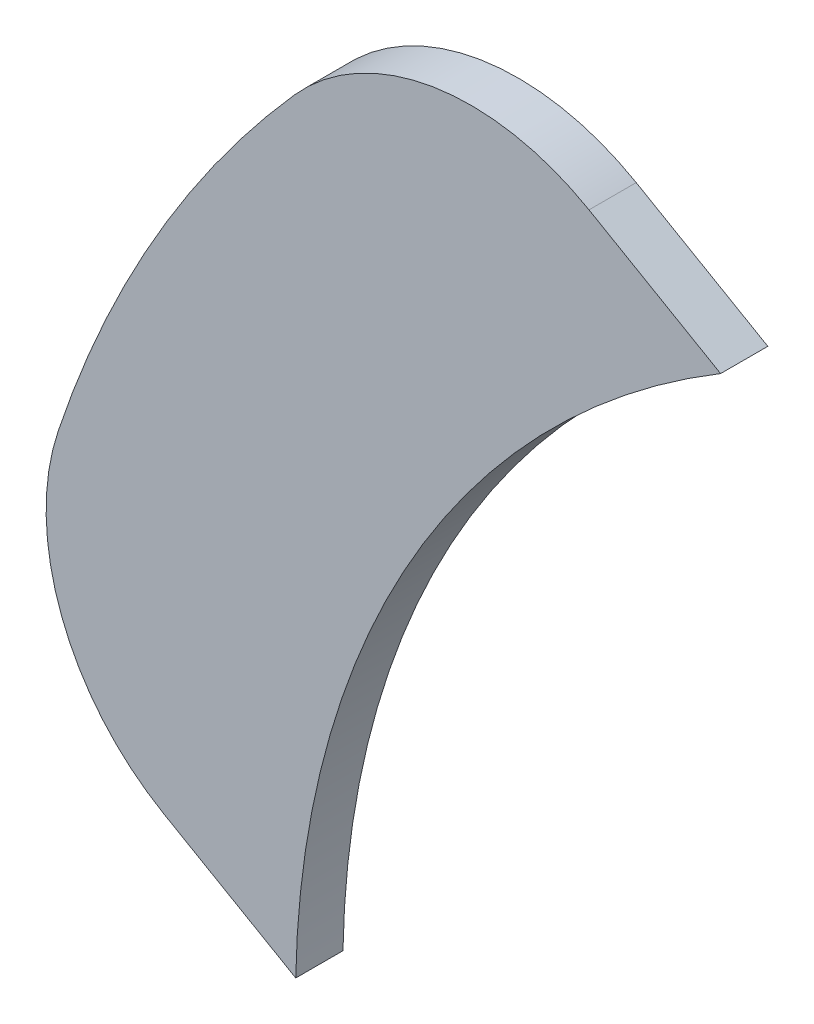
ISO-10303-21;
HEADER;
FILE_DESCRIPTION(('STEP AP214'),'2;1');
FILE_NAME('part.step','',(''),(''),'','','');
FILE_SCHEMA(('AUTOMOTIVE_DESIGN { 1 0 10303 214 1 1 1 1 }'));
ENDSEC;
DATA;
#1=APPLICATION_CONTEXT('core data for automotive mechanical design processes');
#2=APPLICATION_PROTOCOL_DEFINITION('international standard','automotive_design',2000,#1);
#3=PRODUCT_CONTEXT('',#1,'mechanical');
#4=PRODUCT('Part','Part','',(#3));
#5=PRODUCT_RELATED_PRODUCT_CATEGORY('part','',(#4));
#6=PRODUCT_DEFINITION_FORMATION('','',#4);
#7=PRODUCT_DEFINITION_CONTEXT('part definition',#1,'design');
#8=PRODUCT_DEFINITION('design','',#6,#7);
#9=PRODUCT_DEFINITION_SHAPE('','',#8);
#10=(LENGTH_UNIT() NAMED_UNIT(*) SI_UNIT(.MILLI.,.METRE.));
#11=(NAMED_UNIT(*) PLANE_ANGLE_UNIT() SI_UNIT($,.RADIAN.));
#12=(NAMED_UNIT(*) SI_UNIT($,.STERADIAN.) SOLID_ANGLE_UNIT());
#13=UNCERTAINTY_MEASURE_WITH_UNIT(LENGTH_MEASURE(1.E-05),#10,'distance_accuracy_value','');
#14=(GEOMETRIC_REPRESENTATION_CONTEXT(3) GLOBAL_UNCERTAINTY_ASSIGNED_CONTEXT((#13)) GLOBAL_UNIT_ASSIGNED_CONTEXT((#10,
#11,#12)) REPRESENTATION_CONTEXT('',''));
#15=CARTESIAN_POINT('',(0.,0.,0.));
#16=DIRECTION('',(0.,0.,1.));
#17=DIRECTION('',(1.,0.,0.));
#18=AXIS2_PLACEMENT_3D('',#15,#16,#17);
#19=CARTESIAN_POINT('',(-29.7201256670216,26.3965268612452,2.));
#20=DIRECTION('',(0.,0.,-1.));
#21=DIRECTION('',(-1.,0.,0.));
#22=AXIS2_PLACEMENT_3D('',#19,#20,#21);
#23=CYLINDRICAL_SURFACE('',#22,10.);
#24=CARTESIAN_POINT('',(-29.7201256670216,26.3965268612452,0.));
#25=DIRECTION('',(0.,0.,1.));
#26=DIRECTION('',(-1.,0.,0.));
#27=AXIS2_PLACEMENT_3D('',#24,#25,#26);
#28=CIRCLE('',#27,10.);
#29=CARTESIAN_POINT('',(-24.7201256670213,35.0567808990895,0.));
#30=VERTEX_POINT('',#29);
#31=CARTESIAN_POINT('',(-37.1968868411151,33.0371625496088,0.));
#32=VERTEX_POINT('',#31);
#33=EDGE_CURVE('E117',#30,#32,#28,.T.);
#34=ORIENTED_EDGE('',*,*,#33,.T.);
#35=DIRECTION('',(0.,0.,-1.));
#36=VECTOR('',#35,1.);
#37=CARTESIAN_POINT('',(-37.1968868411151,33.0371625496088,2.));
#38=LINE('',#37,#36);
#39=CARTESIAN_POINT('',(-37.1968868411151,33.0371625496088,2.));
#40=VERTEX_POINT('',#39);
#41=EDGE_CURVE('E11',#40,#32,#38,.T.);
#42=ORIENTED_EDGE('',*,*,#41,.F.);
#43=CARTESIAN_POINT('',(-29.7201256670216,26.3965268612452,2.));
#44=DIRECTION('',(0.,0.,1.));
#45=DIRECTION('',(-1.,0.,0.));
#46=AXIS2_PLACEMENT_3D('',#43,#44,#45);
#47=CIRCLE('',#46,10.);
#48=CARTESIAN_POINT('',(-24.7201256670213,35.0567808990895,2.));
#49=VERTEX_POINT('',#48);
#50=EDGE_CURVE('E127',#49,#40,#47,.T.);
#51=ORIENTED_EDGE('',*,*,#50,.F.);
#52=DIRECTION('',(0.,0.,-1.));
#53=VECTOR('',#52,1.);
#54=CARTESIAN_POINT('',(-24.7201256670213,35.0567808990895,2.));
#55=LINE('',#54,#53);
#56=EDGE_CURVE('E113',#49,#30,#55,.T.);
#57=ORIENTED_EDGE('',*,*,#56,.T.);
#58=EDGE_LOOP('',(#34,#42,#51,#57));
#59=FACE_BOUND('',#58,.T.);
#60=ADVANCED_FACE('F33',(#59),#23,.T.);
#61=CARTESIAN_POINT('',(0.,0.,2.));
#62=DIRECTION('',(0.,0.,-1.));
#63=DIRECTION('',(-1.,0.,0.));
#64=AXIS2_PLACEMENT_3D('',#61,#62,#63);
#65=CYLINDRICAL_SURFACE('',#64,49.75);
#66=CARTESIAN_POINT('',(0.,0.,0.));
#67=DIRECTION('',(0.,0.,1.));
#68=DIRECTION('',(1.,0.,0.));
#69=AXIS2_PLACEMENT_3D('',#66,#67,#68);
#70=CIRCLE('',#69,49.75);
#71=CARTESIAN_POINT('',(-47.2094654574742,15.694867671298,0.));
#72=VERTEX_POINT('',#71);
#73=EDGE_CURVE('E120',#32,#72,#70,.T.);
#74=ORIENTED_EDGE('',*,*,#73,.T.);
#75=DIRECTION('',(0.,0.,-1.));
#76=VECTOR('',#75,1.);
#77=CARTESIAN_POINT('',(-47.2094654574742,15.694867671298,2.));
#78=LINE('',#77,#76);
#79=CARTESIAN_POINT('',(-47.2094654574742,15.694867671298,2.));
#80=VERTEX_POINT('',#79);
#81=EDGE_CURVE('E41',#80,#72,#78,.T.);
#82=ORIENTED_EDGE('',*,*,#81,.F.);
#83=CARTESIAN_POINT('',(0.,0.,2.));
#84=DIRECTION('',(0.,0.,1.));
#85=DIRECTION('',(1.,0.,0.));
#86=AXIS2_PLACEMENT_3D('',#83,#84,#85);
#87=CIRCLE('',#86,49.75);
#88=EDGE_CURVE('E86',#40,#80,#87,.T.);
#89=ORIENTED_EDGE('',*,*,#88,.F.);
#90=ORIENTED_EDGE('',*,*,#41,.T.);
#91=EDGE_LOOP('',(#74,#82,#89,#90));
#92=FACE_BOUND('',#91,.T.);
#93=ADVANCED_FACE('F151',(#92),#65,.T.);
#94=CARTESIAN_POINT('',(-37.7201256670271,12.5401204006853,2.));
#95=DIRECTION('',(0.,0.,-1.));
#96=DIRECTION('',(-1.,0.,0.));
#97=AXIS2_PLACEMENT_3D('',#94,#95,#96);
#98=CYLINDRICAL_SURFACE('',#97,10.);
#99=CARTESIAN_POINT('',(-37.7201256670271,12.5401204006853,0.));
#100=DIRECTION('',(0.,0.,1.));
#101=DIRECTION('',(1.,0.,0.));
#102=AXIS2_PLACEMENT_3D('',#99,#100,#101);
#103=CIRCLE('',#102,10.);
#104=CARTESIAN_POINT('',(-42.7201256670271,3.87986636284091,0.));
#105=VERTEX_POINT('',#104);
#106=EDGE_CURVE('E122',#72,#105,#103,.T.);
#107=ORIENTED_EDGE('',*,*,#106,.T.);
#108=DIRECTION('',(0.,0.,-1.));
#109=VECTOR('',#108,1.);
#110=CARTESIAN_POINT('',(-42.7201256670271,3.87986636284091,2.));
#111=LINE('',#110,#109);
#112=CARTESIAN_POINT('',(-42.7201256670271,3.87986636284091,2.));
#113=VERTEX_POINT('',#112);
#114=EDGE_CURVE('E108',#113,#105,#111,.T.);
#115=ORIENTED_EDGE('',*,*,#114,.F.);
#116=CARTESIAN_POINT('',(-37.7201256670271,12.5401204006853,2.));
#117=DIRECTION('',(0.,0.,1.));
#118=DIRECTION('',(1.,0.,0.));
#119=AXIS2_PLACEMENT_3D('',#116,#117,#118);
#120=CIRCLE('',#119,10.);
#121=EDGE_CURVE('E99',#80,#113,#120,.T.);
#122=ORIENTED_EDGE('',*,*,#121,.F.);
#123=ORIENTED_EDGE('',*,*,#81,.T.);
#124=EDGE_LOOP('',(#107,#115,#122,#123));
#125=FACE_BOUND('',#124,.T.);
#126=ADVANCED_FACE('F133',(#125),#98,.T.);
#127=CARTESIAN_POINT('',(-42.7201256670271,3.87986636284091,2.));
#128=DIRECTION('',(0.500000000000001,0.866025403784438,0.));
#129=DIRECTION('',(-0.866025403784438,0.500000000000001,0.));
#130=AXIS2_PLACEMENT_3D('',#127,#128,#129);
#131=PLANE('',#130);
#132=DIRECTION('',(0.866025403784438,-0.500000000000001,0.));
#133=VECTOR('',#132,1.);
#134=CARTESIAN_POINT('',(-42.7201256670271,3.87986636284091,0.));
#135=LINE('',#134,#133);
#136=CARTESIAN_POINT('',(-37.1441268295893,0.660561933045117,0.));
#137=VERTEX_POINT('',#136);
#138=EDGE_CURVE('E107',#105,#137,#135,.T.);
#139=ORIENTED_EDGE('',*,*,#138,.T.);
#140=DIRECTION('',(0.,0.,-1.));
#141=VECTOR('',#140,1.);
#142=CARTESIAN_POINT('',(-37.1441268295893,0.660561933045117,2.));
#143=LINE('',#142,#141);
#144=CARTESIAN_POINT('',(-37.1441268295893,0.660561933045117,2.));
#145=VERTEX_POINT('',#144);
#146=EDGE_CURVE('E104',#145,#137,#143,.T.);
#147=ORIENTED_EDGE('',*,*,#146,.F.);
#148=DIRECTION('',(0.866025403784438,-0.500000000000001,0.));
#149=VECTOR('',#148,1.);
#150=CARTESIAN_POINT('',(-42.7201256670271,3.87986636284091,2.));
#151=LINE('',#150,#149);
#152=EDGE_CURVE('E93',#113,#145,#151,.T.);
#153=ORIENTED_EDGE('',*,*,#152,.F.);
#154=ORIENTED_EDGE('',*,*,#114,.T.);
#155=EDGE_LOOP('',(#139,#147,#153,#154));
#156=FACE_BOUND('',#155,.T.);
#157=ADVANCED_FACE('F105',(#156),#131,.F.);
#158=CARTESIAN_POINT('',(0.,0.,2.));
#159=DIRECTION('',(0.,0.,-1.));
#160=DIRECTION('',(-1.,0.,0.));
#161=AXIS2_PLACEMENT_3D('',#158,#159,#160);
#162=CYLINDRICAL_SURFACE('',#161,37.15);
#163=CARTESIAN_POINT('',(0.,0.,0.));
#164=DIRECTION('',(0.,0.,-1.));
#165=DIRECTION('',(1.,0.,0.));
#166=AXIS2_PLACEMENT_3D('',#163,#164,#165);
#167=CIRCLE('',#166,37.15);
#168=CARTESIAN_POINT('',(-19.1441268295836,31.8374764692935,0.));
#169=VERTEX_POINT('',#168);
#170=EDGE_CURVE('E72',#137,#169,#167,.T.);
#171=ORIENTED_EDGE('',*,*,#170,.T.);
#172=DIRECTION('',(0.,0.,-1.));
#173=VECTOR('',#172,1.);
#174=CARTESIAN_POINT('',(-19.1441268295836,31.8374764692935,2.));
#175=LINE('',#174,#173);
#176=CARTESIAN_POINT('',(-19.1441268295836,31.8374764692935,2.));
#177=VERTEX_POINT('',#176);
#178=EDGE_CURVE('E109',#177,#169,#175,.T.);
#179=ORIENTED_EDGE('',*,*,#178,.F.);
#180=CARTESIAN_POINT('',(0.,0.,2.));
#181=DIRECTION('',(0.,0.,-1.));
#182=DIRECTION('',(1.,0.,0.));
#183=AXIS2_PLACEMENT_3D('',#180,#181,#182);
#184=CIRCLE('',#183,37.15);
#185=EDGE_CURVE('E97',#145,#177,#184,.T.);
#186=ORIENTED_EDGE('',*,*,#185,.F.);
#187=ORIENTED_EDGE('',*,*,#146,.T.);
#188=EDGE_LOOP('',(#171,#179,#186,#187));
#189=FACE_BOUND('',#188,.T.);
#190=ADVANCED_FACE('F111',(#189),#162,.F.);
#191=CARTESIAN_POINT('',(-24.7201256670213,35.0567808990895,2.));
#192=DIRECTION('',(-0.500000000000028,-0.866025403784423,0.));
#193=DIRECTION('',(0.866025403784423,-0.500000000000028,0.));
#194=AXIS2_PLACEMENT_3D('',#191,#192,#193);
#195=PLANE('',#194);
#196=DIRECTION('',(-0.866025403784423,0.500000000000028,0.));
#197=VECTOR('',#196,1.);
#198=CARTESIAN_POINT('',(-24.7201256670213,35.0567808990895,0.));
#199=LINE('',#198,#197);
#200=EDGE_CURVE('E78',#169,#30,#199,.T.);
#201=ORIENTED_EDGE('',*,*,#200,.T.);
#202=ORIENTED_EDGE('',*,*,#56,.F.);
#203=DIRECTION('',(-0.866025403784423,0.500000000000028,0.));
#204=VECTOR('',#203,1.);
#205=CARTESIAN_POINT('',(-24.7201256670213,35.0567808990895,2.));
#206=LINE('',#205,#204);
#207=EDGE_CURVE('E49',#177,#49,#206,.T.);
#208=ORIENTED_EDGE('',*,*,#207,.F.);
#209=ORIENTED_EDGE('',*,*,#178,.T.);
#210=EDGE_LOOP('',(#201,#202,#208,#209));
#211=FACE_BOUND('',#210,.T.);
#212=ADVANCED_FACE('F140',(#211),#195,.F.);
#213=CARTESIAN_POINT('',(-29.7201256670216,26.3965268612452,2.));
#214=DIRECTION('',(0.,0.,-1.));
#215=DIRECTION('',(-1.,0.,0.));
#216=AXIS2_PLACEMENT_3D('',#213,#214,#215);
#217=PLANE('',#216);
#218=ORIENTED_EDGE('',*,*,#50,.T.);
#219=ORIENTED_EDGE('',*,*,#88,.T.);
#220=ORIENTED_EDGE('',*,*,#121,.T.);
#221=ORIENTED_EDGE('',*,*,#152,.T.);
#222=ORIENTED_EDGE('',*,*,#185,.T.);
#223=ORIENTED_EDGE('',*,*,#207,.T.);
#224=EDGE_LOOP('',(#218,#219,#220,#221,#222,#223));
#225=FACE_BOUND('',#224,.T.);
#226=ADVANCED_FACE('F95',(#225),#217,.F.);
#227=CARTESIAN_POINT('',(-29.7201256670216,26.3965268612452,0.));
#228=DIRECTION('',(0.,0.,-1.));
#229=DIRECTION('',(-1.,0.,0.));
#230=AXIS2_PLACEMENT_3D('',#227,#228,#229);
#231=PLANE('',#230);
#232=ORIENTED_EDGE('',*,*,#33,.F.);
#233=ORIENTED_EDGE('',*,*,#200,.F.);
#234=ORIENTED_EDGE('',*,*,#170,.F.);
#235=ORIENTED_EDGE('',*,*,#138,.F.);
#236=ORIENTED_EDGE('',*,*,#106,.F.);
#237=ORIENTED_EDGE('',*,*,#73,.F.);
#238=EDGE_LOOP('',(#232,#233,#234,#235,#236,#237));
#239=FACE_BOUND('',#238,.T.);
#240=ADVANCED_FACE('F136',(#239),#231,.T.);
#241=CLOSED_SHELL('',(#60,#93,#126,#157,#190,#212,#226,#240));
#242=MANIFOLD_SOLID_BREP('B2',#241);
#243=ADVANCED_BREP_SHAPE_REPRESENTATION('',(#18,#242),#14);
#244=SHAPE_DEFINITION_REPRESENTATION(#9,#243);
ENDSEC;
END-ISO-10303-21;
